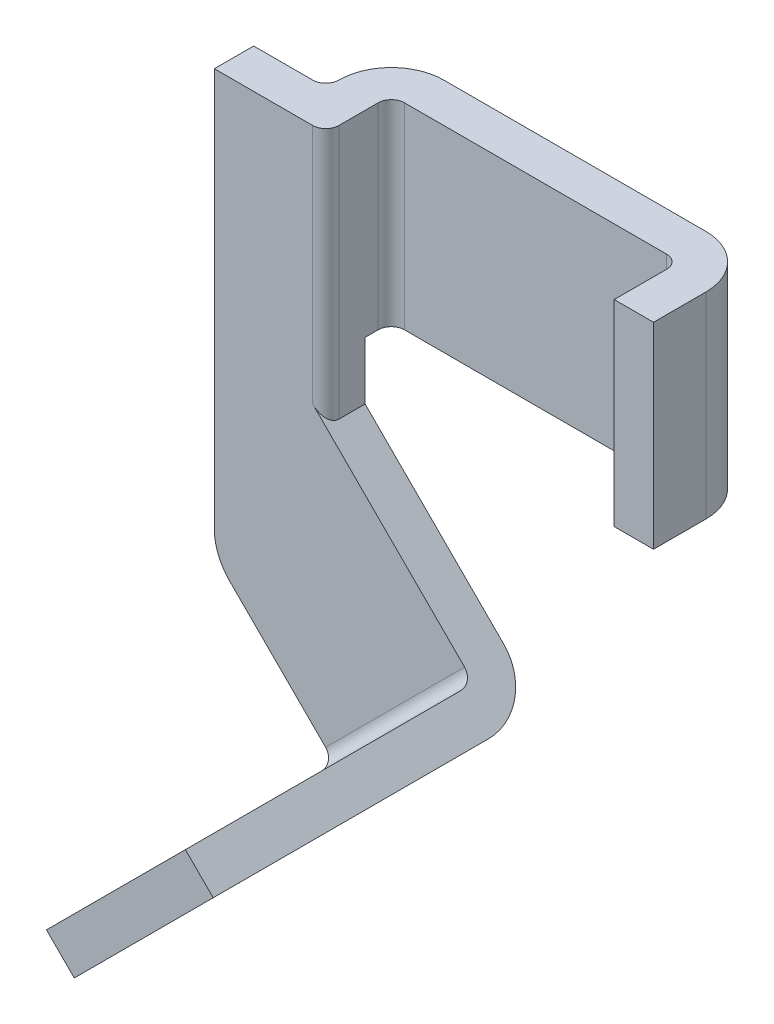
ISO-10303-21;
HEADER;
FILE_DESCRIPTION(('STEP AP214'),'2;1');
FILE_NAME('part.step','',(''),(''),'','','');
FILE_SCHEMA(('AUTOMOTIVE_DESIGN { 1 0 10303 214 1 1 1 1 }'));
ENDSEC;
DATA;
#1=APPLICATION_CONTEXT('core data for automotive mechanical design processes');
#2=APPLICATION_PROTOCOL_DEFINITION('international standard','automotive_design',2000,#1);
#3=PRODUCT_CONTEXT('',#1,'mechanical');
#4=PRODUCT('Part','Part','',(#3));
#5=PRODUCT_RELATED_PRODUCT_CATEGORY('part','',(#4));
#6=PRODUCT_DEFINITION_FORMATION('','',#4);
#7=PRODUCT_DEFINITION_CONTEXT('part definition',#1,'design');
#8=PRODUCT_DEFINITION('design','',#6,#7);
#9=PRODUCT_DEFINITION_SHAPE('','',#8);
#10=(LENGTH_UNIT() NAMED_UNIT(*) SI_UNIT(.MILLI.,.METRE.));
#11=(NAMED_UNIT(*) PLANE_ANGLE_UNIT() SI_UNIT($,.RADIAN.));
#12=(NAMED_UNIT(*) SI_UNIT($,.STERADIAN.) SOLID_ANGLE_UNIT());
#13=UNCERTAINTY_MEASURE_WITH_UNIT(LENGTH_MEASURE(1.E-05),#10,'distance_accuracy_value','');
#14=(GEOMETRIC_REPRESENTATION_CONTEXT(3) GLOBAL_UNCERTAINTY_ASSIGNED_CONTEXT((#13)) GLOBAL_UNIT_ASSIGNED_CONTEXT((#10,
#11,#12)) REPRESENTATION_CONTEXT('',''));
#15=CARTESIAN_POINT('',(0.,0.,0.));
#16=DIRECTION('',(0.,0.,1.));
#17=DIRECTION('',(1.,0.,0.));
#18=AXIS2_PLACEMENT_3D('',#15,#16,#17);
#19=CARTESIAN_POINT('',(-9.549999999999,7.29,2.2));
#20=DIRECTION('',(1.,0.,0.));
#21=DIRECTION('',(0.,1.,0.));
#22=AXIS2_PLACEMENT_3D('',#19,#20,#21);
#23=PLANE('',#22);
#24=DIRECTION('',(0.,1.,0.));
#25=VECTOR('',#24,1.);
#26=CARTESIAN_POINT('',(-9.550000000009,7.455685424959,2.50000000001));
#27=LINE('',#26,#25);
#28=CARTESIAN_POINT('',(-9.549999999999,7.455685424949,2.5));
#29=VERTEX_POINT('',#28);
#30=CARTESIAN_POINT('',(-9.549999999999,10.5,2.5));
#31=VERTEX_POINT('',#30);
#32=EDGE_CURVE('E429',#29,#31,#27,.T.);
#33=ORIENTED_EDGE('',*,*,#32,.T.);
#34=DIRECTION('',(0.,0.,1.));
#35=VECTOR('',#34,1.);
#36=CARTESIAN_POINT('',(-9.550000000009,10.50000000001,2.20000000001));
#37=LINE('',#36,#35);
#38=CARTESIAN_POINT('',(-9.549999999999,10.5,2.2));
#39=VERTEX_POINT('',#38);
#40=EDGE_CURVE('E268',#39,#31,#37,.T.);
#41=ORIENTED_EDGE('',*,*,#40,.F.);
#42=DIRECTION('',(0.,-1.,0.));
#43=VECTOR('',#42,1.);
#44=CARTESIAN_POINT('',(-9.550000000009,10.50000000001,2.20000000001));
#45=LINE('',#44,#43);
#46=CARTESIAN_POINT('',(-9.549999999999,7.455685424949,2.2));
#47=VERTEX_POINT('',#46);
#48=EDGE_CURVE('E281',#39,#47,#45,.T.);
#49=ORIENTED_EDGE('',*,*,#48,.T.);
#50=DIRECTION('',(0.,0.,-1.));
#51=VECTOR('',#50,1.);
#52=CARTESIAN_POINT('',(-9.550000000009,7.455685424959,2.50000000001));
#53=LINE('',#52,#51);
#54=EDGE_CURVE('E326',#29,#47,#53,.T.);
#55=ORIENTED_EDGE('',*,*,#54,.F.);
#56=EDGE_LOOP('',(#33,#41,#49,#55));
#57=FACE_BOUND('',#56,.T.);
#58=ADVANCED_FACE('F17',(#57),#23,.F.);
#59=CARTESIAN_POINT('',(-6.199999999999,10.5,2.5));
#60=DIRECTION('',(0.,0.,1.));
#61=DIRECTION('',(1.,0.,0.));
#62=AXIS2_PLACEMENT_3D('',#59,#60,#61);
#63=PLANE('',#62);
#64=DIRECTION('',(-1.,0.,0.));
#65=VECTOR('',#64,1.);
#66=CARTESIAN_POINT('',(-6.200000000009,9.00000000001,2.50000000001));
#67=LINE('',#66,#65);
#68=CARTESIAN_POINT('',(-6.199999999999,9.,2.5));
#69=VERTEX_POINT('',#68);
#70=CARTESIAN_POINT('',(-6.499999999999,9.,2.5));
#71=VERTEX_POINT('',#70);
#72=EDGE_CURVE('E343',#69,#71,#67,.T.);
#73=ORIENTED_EDGE('',*,*,#72,.F.);
#74=DIRECTION('',(0.,-1.,0.));
#75=VECTOR('',#74,1.);
#76=CARTESIAN_POINT('',(-6.200000000009,10.50000000001,2.50000000001));
#77=LINE('',#76,#75);
#78=CARTESIAN_POINT('',(-6.199999999999,10.5,2.5));
#79=VERTEX_POINT('',#78);
#80=EDGE_CURVE('E540',#79,#69,#77,.T.);
#81=ORIENTED_EDGE('',*,*,#80,.F.);
#82=DIRECTION('',(1.,0.,0.));
#83=VECTOR('',#82,1.);
#84=CARTESIAN_POINT('',(-6.500000000009,10.50000000001,2.50000000001));
#85=LINE('',#84,#83);
#86=CARTESIAN_POINT('',(-6.499999999999,10.5,2.5));
#87=VERTEX_POINT('',#86);
#88=EDGE_CURVE('E307',#87,#79,#85,.T.);
#89=ORIENTED_EDGE('',*,*,#88,.F.);
#90=DIRECTION('',(0.,1.,0.));
#91=VECTOR('',#90,1.);
#92=CARTESIAN_POINT('',(-6.500000000009,9.00000000001,2.50000000001));
#93=LINE('',#92,#91);
#94=EDGE_CURVE('E11',#71,#87,#93,.T.);
#95=ORIENTED_EDGE('',*,*,#94,.F.);
#96=EDGE_LOOP('',(#73,#81,#89,#95));
#97=FACE_BOUND('',#96,.T.);
#98=ADVANCED_FACE('F484',(#97),#63,.T.);
#99=CARTESIAN_POINT('',(-6.499999999999,10.5,2.5));
#100=DIRECTION('',(1.,0.,0.));
#101=DIRECTION('',(0.,1.,0.));
#102=AXIS2_PLACEMENT_3D('',#99,#100,#101);
#103=PLANE('',#102);
#104=DIRECTION('',(0.,0.,1.));
#105=VECTOR('',#104,1.);
#106=CARTESIAN_POINT('',(-6.500000000009,9.00000000001,2.10000000001));
#107=LINE('',#106,#105);
#108=CARTESIAN_POINT('',(-6.499999999999,9.,2.1));
#109=VERTEX_POINT('',#108);
#110=EDGE_CURVE('E347',#109,#71,#107,.T.);
#111=ORIENTED_EDGE('',*,*,#110,.T.);
#112=ORIENTED_EDGE('',*,*,#94,.T.);
#113=DIRECTION('',(0.,0.,-1.));
#114=VECTOR('',#113,1.);
#115=CARTESIAN_POINT('',(-6.500000000009,10.50000000001,2.50000000001));
#116=LINE('',#115,#114);
#117=CARTESIAN_POINT('',(-6.499999999999,10.5,2.1));
#118=VERTEX_POINT('',#117);
#119=EDGE_CURVE('E299',#87,#118,#116,.T.);
#120=ORIENTED_EDGE('',*,*,#119,.T.);
#121=DIRECTION('',(0.,1.,0.));
#122=VECTOR('',#121,1.);
#123=CARTESIAN_POINT('',(-6.500000000009,9.00000000001,2.10000000001));
#124=LINE('',#123,#122);
#125=EDGE_CURVE('E27',#109,#118,#124,.T.);
#126=ORIENTED_EDGE('',*,*,#125,.F.);
#127=EDGE_LOOP('',(#111,#112,#120,#126));
#128=FACE_BOUND('',#127,.T.);
#129=ADVANCED_FACE('F487',(#128),#103,.F.);
#130=CARTESIAN_POINT('',(-6.599999999999,10.5,2.1));
#131=DIRECTION('',(0.,-1.,0.));
#132=DIRECTION('',(0.,0.,-1.));
#133=AXIS2_PLACEMENT_3D('',#130,#131,#132);
#134=CYLINDRICAL_SURFACE('',#133,0.1);
#135=ORIENTED_EDGE('',*,*,#125,.T.);
#136=CARTESIAN_POINT('',(-6.600000000009,10.50000000001,2.10000000001));
#137=DIRECTION('',(0.,-1.,0.));
#138=DIRECTION('',(0.,0.,-1.));
#139=AXIS2_PLACEMENT_3D('',#136,#137,#138);
#140=CIRCLE('',#139,0.10000000001);
#141=CARTESIAN_POINT('',(-6.599999999999,10.5,2.));
#142=VERTEX_POINT('',#141);
#143=EDGE_CURVE('E295',#142,#118,#140,.T.);
#144=ORIENTED_EDGE('',*,*,#143,.F.);
#145=DIRECTION('',(0.,-1.,0.));
#146=VECTOR('',#145,1.);
#147=CARTESIAN_POINT('',(-6.600000000009,10.50000000001,2.00000000001));
#148=LINE('',#147,#146);
#149=CARTESIAN_POINT('',(-6.599999999999,9.,2.));
#150=VERTEX_POINT('',#149);
#151=EDGE_CURVE('E276',#142,#150,#148,.T.);
#152=ORIENTED_EDGE('',*,*,#151,.T.);
#153=CARTESIAN_POINT('',(-6.600000000009,9.00000000001,2.10000000001));
#154=DIRECTION('',(0.,1.,0.));
#155=DIRECTION('',(1.,0.,0.));
#156=AXIS2_PLACEMENT_3D('',#153,#154,#155);
#157=CIRCLE('',#156,0.10000000001);
#158=EDGE_CURVE('E351',#109,#150,#157,.T.);
#159=ORIENTED_EDGE('',*,*,#158,.F.);
#160=EDGE_LOOP('',(#135,#144,#152,#159));
#161=FACE_BOUND('',#160,.T.);
#162=ADVANCED_FACE('F600',(#161),#134,.F.);
#163=CARTESIAN_POINT('',(-6.199999999999,10.5,2.));
#164=DIRECTION('',(0.,0.,-1.));
#165=DIRECTION('',(0.,-1.,0.));
#166=AXIS2_PLACEMENT_3D('',#163,#164,#165);
#167=PLANE('',#166);
#168=DIRECTION('',(1.,0.,0.));
#169=VECTOR('',#168,1.);
#170=CARTESIAN_POINT('',(-8.600000000009,9.00000000001,2.00000000001));
#171=LINE('',#170,#169);
#172=CARTESIAN_POINT('',(-8.599999999999,9.,2.));
#173=VERTEX_POINT('',#172);
#174=EDGE_CURVE('E362',#173,#150,#171,.T.);
#175=ORIENTED_EDGE('',*,*,#174,.T.);
#176=ORIENTED_EDGE('',*,*,#151,.F.);
#177=DIRECTION('',(-1.,0.,0.));
#178=VECTOR('',#177,1.);
#179=CARTESIAN_POINT('',(-6.600000000009,10.50000000001,2.00000000001));
#180=LINE('',#179,#178);
#181=CARTESIAN_POINT('',(-8.599999999999,10.5,2.));
#182=VERTEX_POINT('',#181);
#183=EDGE_CURVE('E291',#142,#182,#180,.T.);
#184=ORIENTED_EDGE('',*,*,#183,.T.);
#185=DIRECTION('',(0.,1.,0.));
#186=VECTOR('',#185,1.);
#187=CARTESIAN_POINT('',(-8.600000000009,9.00000000001,2.00000000001));
#188=LINE('',#187,#186);
#189=EDGE_CURVE('E411',#173,#182,#188,.T.);
#190=ORIENTED_EDGE('',*,*,#189,.F.);
#191=EDGE_LOOP('',(#175,#176,#184,#190));
#192=FACE_BOUND('',#191,.T.);
#193=ADVANCED_FACE('F597',(#192),#167,.F.);
#194=CARTESIAN_POINT('',(-8.599999999999,10.5,2.1));
#195=DIRECTION('',(0.,-1.,0.));
#196=DIRECTION('',(0.,0.,-1.));
#197=AXIS2_PLACEMENT_3D('',#194,#195,#196);
#198=CYLINDRICAL_SURFACE('',#197,0.1);
#199=ORIENTED_EDGE('',*,*,#189,.T.);
#200=CARTESIAN_POINT('',(-8.600000000009,10.50000000001,2.10000000001));
#201=DIRECTION('',(0.,-1.,0.));
#202=DIRECTION('',(-1.,0.,0.));
#203=AXIS2_PLACEMENT_3D('',#200,#201,#202);
#204=CIRCLE('',#203,0.10000000001);
#205=CARTESIAN_POINT('',(-8.699999999999,10.5,2.1));
#206=VERTEX_POINT('',#205);
#207=EDGE_CURVE('E255',#206,#182,#204,.T.);
#208=ORIENTED_EDGE('',*,*,#207,.F.);
#209=DIRECTION('',(0.,-1.,0.));
#210=VECTOR('',#209,1.);
#211=CARTESIAN_POINT('',(-8.700000000009,10.50000000001,2.10000000001));
#212=LINE('',#211,#210);
#213=CARTESIAN_POINT('',(-8.699999999999,9.,2.1));
#214=VERTEX_POINT('',#213);
#215=EDGE_CURVE('E250',#206,#214,#212,.T.);
#216=ORIENTED_EDGE('',*,*,#215,.T.);
#217=CARTESIAN_POINT('',(-8.600000000009,9.00000000001,2.10000000001));
#218=DIRECTION('',(0.,1.,0.));
#219=DIRECTION('',(0.,0.,-1.));
#220=AXIS2_PLACEMENT_3D('',#217,#218,#219);
#221=CIRCLE('',#220,0.10000000001);
#222=EDGE_CURVE('E366',#173,#214,#221,.T.);
#223=ORIENTED_EDGE('',*,*,#222,.F.);
#224=EDGE_LOOP('',(#199,#208,#216,#223));
#225=FACE_BOUND('',#224,.T.);
#226=ADVANCED_FACE('F592',(#225),#198,.F.);
#227=CARTESIAN_POINT('',(-8.699999999999,10.5,2.2));
#228=DIRECTION('',(-1.,0.,0.));
#229=DIRECTION('',(0.,0.,1.));
#230=AXIS2_PLACEMENT_3D('',#227,#228,#229);
#231=PLANE('',#230);
#232=DIRECTION('',(0.,0.,-1.));
#233=VECTOR('',#232,1.);
#234=CARTESIAN_POINT('',(-8.700000000009,10.50000000001,2.40000000001));
#235=LINE('',#234,#233);
#236=CARTESIAN_POINT('',(-8.699999999999,10.5,2.4));
#237=VERTEX_POINT('',#236);
#238=EDGE_CURVE('E247',#237,#206,#235,.T.);
#239=ORIENTED_EDGE('',*,*,#238,.F.);
#240=DIRECTION('',(0.,1.,0.));
#241=VECTOR('',#240,1.);
#242=CARTESIAN_POINT('',(-8.700000000009,8.56000000001,2.40000000001));
#243=LINE('',#242,#241);
#244=CARTESIAN_POINT('',(-8.699999999999,8.56,2.4));
#245=VERTEX_POINT('',#244);
#246=EDGE_CURVE('E235',#245,#237,#243,.T.);
#247=ORIENTED_EDGE('',*,*,#246,.F.);
#248=DIRECTION('',(0.,0.,1.));
#249=VECTOR('',#248,1.);
#250=CARTESIAN_POINT('',(-8.700000000009,8.56000000001,2.20000000001));
#251=LINE('',#250,#249);
#252=CARTESIAN_POINT('',(-8.699999999999,8.56,2.2));
#253=VERTEX_POINT('',#252);
#254=EDGE_CURVE('E64',#253,#245,#251,.T.);
#255=ORIENTED_EDGE('',*,*,#254,.F.);
#256=DIRECTION('',(0.,1.,0.));
#257=VECTOR('',#256,1.);
#258=CARTESIAN_POINT('',(-8.700000000009,8.56000000001,2.20000000001));
#259=LINE('',#258,#257);
#260=CARTESIAN_POINT('',(-8.699999999999,9.,2.2));
#261=VERTEX_POINT('',#260);
#262=EDGE_CURVE('E277',#253,#261,#259,.T.);
#263=ORIENTED_EDGE('',*,*,#262,.T.);
#264=DIRECTION('',(0.,0.,1.));
#265=VECTOR('',#264,1.);
#266=CARTESIAN_POINT('',(-8.700000000009,9.00000000001,2.10000000001));
#267=LINE('',#266,#265);
#268=EDGE_CURVE('E370',#214,#261,#267,.T.);
#269=ORIENTED_EDGE('',*,*,#268,.F.);
#270=ORIENTED_EDGE('',*,*,#215,.F.);
#271=EDGE_LOOP('',(#239,#247,#255,#263,#269,#270));
#272=FACE_BOUND('',#271,.T.);
#273=ADVANCED_FACE('F248',(#272),#231,.F.);
#274=CARTESIAN_POINT('',(-8.701471862575,6.441471862576,2.6));
#275=DIRECTION('',(-0.707106781186548,-0.707106781186548,0.));
#276=DIRECTION('',(-0.707106781186548,0.707106781186548,0.));
#277=AXIS2_PLACEMENT_3D('',#274,#275,#276);
#278=CYLINDRICAL_SURFACE('',#277,0.1);
#279=DIRECTION('',(0.707106781186548,0.707106781186548,0.));
#280=VECTOR('',#279,1.);
#281=CARTESIAN_POINT('',(-8.630761184466,6.370761184467,2.600000000011));
#282=LINE('',#281,#280);
#283=CARTESIAN_POINT('',(-8.630761184456,6.370761184457,2.600000000001));
#284=VERTEX_POINT('',#283);
#285=CARTESIAN_POINT('',(-7.570761184456,7.430761184457,2.600000000001));
#286=VERTEX_POINT('',#285);
#287=EDGE_CURVE('E54',#284,#286,#282,.T.);
#288=ORIENTED_EDGE('',*,*,#287,.T.);
#289=CARTESIAN_POINT('',(-7.641471862585,7.501471862586,2.60000000001));
#290=DIRECTION('',(-0.707106781186548,-0.707106781186548,0.));
#291=DIRECTION('',(0.,0.,-1.));
#292=AXIS2_PLACEMENT_3D('',#289,#290,#291);
#293=CIRCLE('',#292,0.10000000001);
#294=CARTESIAN_POINT('',(-7.641471862575,7.501471862576,2.5));
#295=VERTEX_POINT('',#294);
#296=EDGE_CURVE('E308',#295,#286,#293,.T.);
#297=ORIENTED_EDGE('',*,*,#296,.F.);
#298=DIRECTION('',(0.707106781186548,0.707106781186548,0.));
#299=VECTOR('',#298,1.);
#300=CARTESIAN_POINT('',(-8.701471862585,6.441471862586,2.50000000001));
#301=LINE('',#300,#299);
#302=CARTESIAN_POINT('',(-8.701471862575,6.441471862576,2.5));
#303=VERTEX_POINT('',#302);
#304=EDGE_CURVE('E432',#303,#295,#301,.T.);
#305=ORIENTED_EDGE('',*,*,#304,.F.);
#306=CARTESIAN_POINT('',(-8.701471862585,6.441471862586,2.60000000001));
#307=DIRECTION('',(0.707106781186548,0.707106781186548,0.));
#308=DIRECTION('',(0.707106781186548,-0.707106781186548,1.36974867592751E-10));
#309=AXIS2_PLACEMENT_3D('',#306,#307,#308);
#310=CIRCLE('',#309,0.100000000014142);
#311=EDGE_CURVE('E422',#284,#303,#310,.T.);
#312=ORIENTED_EDGE('',*,*,#311,.F.);
#313=EDGE_LOOP('',(#288,#297,#305,#312));
#314=FACE_BOUND('',#313,.T.);
#315=ADVANCED_FACE('F519',(#314),#278,.F.);
#316=CARTESIAN_POINT('',(-8.630761184456,6.370761184457,4.7));
#317=DIRECTION('',(-0.707106781186548,0.707106781186548,0.));
#318=DIRECTION('',(0.,0.,1.));
#319=AXIS2_PLACEMENT_3D('',#316,#317,#318);
#320=PLANE('',#319);
#321=DIRECTION('',(-0.707106781186548,-0.707106781186548,0.));
#322=VECTOR('',#321,1.);
#323=CARTESIAN_POINT('',(-7.570761184466,7.430761184467,4.70000000001));
#324=LINE('',#323,#322);
#325=CARTESIAN_POINT('',(-7.570761184456,7.430761184457,4.7));
#326=VERTEX_POINT('',#325);
#327=CARTESIAN_POINT('',(-8.630761184456,6.370761184457,4.7));
#328=VERTEX_POINT('',#327);
#329=EDGE_CURVE('E290',#326,#328,#324,.T.);
#330=ORIENTED_EDGE('',*,*,#329,.F.);
#331=DIRECTION('',(4.81646429337999E-12,-4.81688723548461E-12,1.));
#332=VECTOR('',#331,1.);
#333=CARTESIAN_POINT('',(-7.570761184466,7.430761184467,2.600000000011));
#334=LINE('',#333,#332);
#335=EDGE_CURVE('E312',#286,#326,#334,.T.);
#336=ORIENTED_EDGE('',*,*,#335,.F.);
#337=ORIENTED_EDGE('',*,*,#287,.F.);
#338=DIRECTION('',(-4.81688723548461E-12,4.81646429337999E-12,-1.));
#339=VECTOR('',#338,1.);
#340=CARTESIAN_POINT('',(-8.630761184466,6.370761184467,4.70000000001));
#341=LINE('',#340,#339);
#342=EDGE_CURVE('E418',#328,#284,#341,.T.);
#343=ORIENTED_EDGE('',*,*,#342,.F.);
#344=EDGE_LOOP('',(#330,#336,#337,#343));
#345=FACE_BOUND('',#344,.T.);
#346=ADVANCED_FACE('F564',(#345),#320,.T.);
#347=CARTESIAN_POINT('',(-8.630761184456,6.370761184457,4.7));
#348=DIRECTION('',(0.,0.,-1.));
#349=DIRECTION('',(0.,-1.,0.));
#350=AXIS2_PLACEMENT_3D('',#347,#348,#349);
#351=PLANE('',#350);
#352=DIRECTION('',(-0.707106781186297,0.707106781186798,0.));
#353=VECTOR('',#352,1.);
#354=CARTESIAN_POINT('',(-7.358629150111,7.218629150111,4.70000000001));
#355=LINE('',#354,#353);
#356=CARTESIAN_POINT('',(-7.358629150101,7.218629150101,4.7));
#357=VERTEX_POINT('',#356);
#358=EDGE_CURVE('E334',#357,#326,#355,.T.);
#359=ORIENTED_EDGE('',*,*,#358,.T.);
#360=ORIENTED_EDGE('',*,*,#329,.T.);
#361=DIRECTION('',(0.707106781186548,-0.707106781186548,0.));
#362=VECTOR('',#361,1.);
#363=CARTESIAN_POINT('',(-8.630761184466,6.370761184467,4.70000000001));
#364=LINE('',#363,#362);
#365=CARTESIAN_POINT('',(-8.418629150101,6.158629150101,4.7));
#366=VERTEX_POINT('',#365);
#367=EDGE_CURVE('E415',#328,#366,#364,.T.);
#368=ORIENTED_EDGE('',*,*,#367,.T.);
#369=DIRECTION('',(0.707106781186548,0.707106781186548,0.));
#370=VECTOR('',#369,1.);
#371=CARTESIAN_POINT('',(-8.418629150111,6.158629150111,4.70000000001));
#372=LINE('',#371,#370);
#373=EDGE_CURVE('E40',#366,#357,#372,.T.);
#374=ORIENTED_EDGE('',*,*,#373,.T.);
#375=EDGE_LOOP('',(#359,#360,#368,#374));
#376=FACE_BOUND('',#375,.T.);
#377=ADVANCED_FACE('F474',(#376),#351,.F.);
#378=CARTESIAN_POINT('',(-7.358629150101,7.218629150101,4.7));
#379=DIRECTION('',(0.707106781186548,-0.707106781186548,0.));
#380=DIRECTION('',(0.,0.,-1.));
#381=AXIS2_PLACEMENT_3D('',#378,#379,#380);
#382=PLANE('',#381);
#383=ORIENTED_EDGE('',*,*,#373,.F.);
#384=DIRECTION('',(-4.82111665652389E-12,4.82238548283774E-12,1.));
#385=VECTOR('',#384,1.);
#386=CARTESIAN_POINT('',(-8.418629150111,6.158629150111,2.600000000008));
#387=LINE('',#386,#385);
#388=CARTESIAN_POINT('',(-8.418629150101,6.158629150101,2.599999999995));
#389=VERTEX_POINT('',#388);
#390=EDGE_CURVE('E408',#389,#366,#387,.T.);
#391=ORIENTED_EDGE('',*,*,#390,.F.);
#392=DIRECTION('',(-0.707106781186548,-0.707106781186548,0.));
#393=VECTOR('',#392,1.);
#394=CARTESIAN_POINT('',(-7.358629150111,7.218629150111,2.600000000008));
#395=LINE('',#394,#393);
#396=CARTESIAN_POINT('',(-7.358629150101,7.218629150101,2.599999999998));
#397=VERTEX_POINT('',#396);
#398=EDGE_CURVE('E403',#397,#389,#395,.T.);
#399=ORIENTED_EDGE('',*,*,#398,.F.);
#400=DIRECTION('',(4.86002733014863E-12,-4.78432069342223E-12,-1.));
#401=VECTOR('',#400,1.);
#402=CARTESIAN_POINT('',(-7.358629150111,7.218629150111,4.70000000001));
#403=LINE('',#402,#401);
#404=EDGE_CURVE('E318',#357,#397,#403,.T.);
#405=ORIENTED_EDGE('',*,*,#404,.F.);
#406=EDGE_LOOP('',(#383,#391,#399,#405));
#407=FACE_BOUND('',#406,.T.);
#408=ADVANCED_FACE('F460',(#407),#382,.T.);
#409=CARTESIAN_POINT('',(-8.699999999999,8.56,2.2));
#410=DIRECTION('',(-0.707106781186548,-0.707106781186548,0.));
#411=DIRECTION('',(-0.707106781186548,0.707106781186548,0.));
#412=AXIS2_PLACEMENT_3D('',#409,#410,#411);
#413=PLANE('',#412);
#414=DIRECTION('',(0.707106781186548,-0.707106781186548,0.));
#415=VECTOR('',#414,1.);
#416=CARTESIAN_POINT('',(-8.700000000009,8.56000000001,2.20000000001));
#417=LINE('',#416,#415);
#418=CARTESIAN_POINT('',(-7.641471862575,7.501471862576,2.2));
#419=VERTEX_POINT('',#418);
#420=EDGE_CURVE('E280',#253,#419,#417,.T.);
#421=ORIENTED_EDGE('',*,*,#420,.F.);
#422=ORIENTED_EDGE('',*,*,#254,.T.);
#423=CARTESIAN_POINT('',(-8.700000000009,8.56000000001,2.40000000001));
#424=CARTESIAN_POINT('',(-8.700000000009,8.56000000001,2.44457753182084));
#425=CARTESIAN_POINT('',(-8.73059851756703,8.59059851756803,2.47329429084901));
#426=CARTESIAN_POINT('',(-8.75905420470987,8.61905420471087,2.50000000001));
#427=CARTESIAN_POINT('',(-8.800000000009,8.66000000001,2.50000000001));
#428=B_SPLINE_CURVE_WITH_KNOTS('',2,(#423,#424,#425,#426,#427),.UNSPECIFIED.,.F.,.F.,(3,2,3),
(0.,0.5,1.),.UNSPECIFIED.);
#429=CARTESIAN_POINT('',(-8.799999999999,8.66,2.5));
#430=VERTEX_POINT('',#429);
#431=EDGE_CURVE('E70',#245,#430,#428,.T.);
#432=ORIENTED_EDGE('',*,*,#431,.T.);
#433=DIRECTION('',(-0.707106781186548,0.707106781186548,0.));
#434=VECTOR('',#433,1.);
#435=CARTESIAN_POINT('',(-7.641471862585,7.501471862586,2.50000000001));
#436=LINE('',#435,#434);
#437=EDGE_CURVE('E436',#295,#430,#436,.T.);
#438=ORIENTED_EDGE('',*,*,#437,.F.);
#439=ORIENTED_EDGE('',*,*,#296,.T.);
#440=ORIENTED_EDGE('',*,*,#335,.T.);
#441=ORIENTED_EDGE('',*,*,#358,.F.);
#442=ORIENTED_EDGE('',*,*,#404,.T.);
#443=CARTESIAN_POINT('',(-7.641471862585,7.501471862586,2.60000000001));
#444=DIRECTION('',(0.707106781186548,0.707106781186548,0.));
#445=DIRECTION('',(0.707106781186548,-0.707106781186548,-3.86002320502962E-11));
#446=AXIS2_PLACEMENT_3D('',#443,#444,#445);
#447=CIRCLE('',#446,0.400000000014142);
#448=EDGE_CURVE('E400',#397,#419,#447,.T.);
#449=ORIENTED_EDGE('',*,*,#448,.T.);
#450=EDGE_LOOP('',(#421,#422,#432,#438,#439,#440,#441,#442,#449));
#451=FACE_BOUND('',#450,.T.);
#452=ADVANCED_FACE('F450',(#451),#413,.F.);
#453=CARTESIAN_POINT('',(-8.799999999999,10.5,2.4));
#454=DIRECTION('',(0.,-1.,0.));
#455=DIRECTION('',(0.,0.,-1.));
#456=AXIS2_PLACEMENT_3D('',#453,#454,#455);
#457=CYLINDRICAL_SURFACE('',#456,0.1);
#458=ORIENTED_EDGE('',*,*,#246,.T.);
#459=CARTESIAN_POINT('',(-8.800000000009,10.50000000001,2.40000000001));
#460=DIRECTION('',(0.,1.,0.));
#461=DIRECTION('',(0.,0.,1.));
#462=AXIS2_PLACEMENT_3D('',#459,#460,#461);
#463=CIRCLE('',#462,0.10000000001);
#464=CARTESIAN_POINT('',(-8.799999999999,10.5,2.5));
#465=VERTEX_POINT('',#464);
#466=EDGE_CURVE('E239',#465,#237,#463,.T.);
#467=ORIENTED_EDGE('',*,*,#466,.F.);
#468=DIRECTION('',(0.,-1.,0.));
#469=VECTOR('',#468,1.);
#470=CARTESIAN_POINT('',(-8.800000000009,10.50000000001,2.50000000001));
#471=LINE('',#470,#469);
#472=EDGE_CURVE('E244',#465,#430,#471,.T.);
#473=ORIENTED_EDGE('',*,*,#472,.T.);
#474=ORIENTED_EDGE('',*,*,#431,.F.);
#475=EDGE_LOOP('',(#458,#467,#473,#474));
#476=FACE_BOUND('',#475,.T.);
#477=ADVANCED_FACE('F237',(#476),#457,.T.);
#478=CARTESIAN_POINT('',(-8.630761184456,6.370761184457,2.5));
#479=DIRECTION('',(0.,0.,1.));
#480=DIRECTION('',(1.,0.,0.));
#481=AXIS2_PLACEMENT_3D('',#478,#479,#480);
#482=PLANE('',#481);
#483=DIRECTION('',(1.,0.,0.));
#484=VECTOR('',#483,1.);
#485=CARTESIAN_POINT('',(-9.550000000009,10.50000000001,2.50000000001));
#486=LINE('',#485,#484);
#487=EDGE_CURVE('E261',#31,#465,#486,.T.);
#488=ORIENTED_EDGE('',*,*,#487,.F.);
#489=ORIENTED_EDGE('',*,*,#32,.F.);
#490=CARTESIAN_POINT('',(-9.150000000009,7.455685424959,2.50000000001));
#491=DIRECTION('',(0.,0.,1.));
#492=DIRECTION('',(-1.,-2.50466293664081E-11,0.));
#493=AXIS2_PLACEMENT_3D('',#490,#491,#492);
#494=CIRCLE('',#493,0.40000000001);
#495=CARTESIAN_POINT('',(-9.432842712475,7.172842712475,2.5));
#496=VERTEX_POINT('',#495);
#497=EDGE_CURVE('E329',#29,#496,#494,.T.);
#498=ORIENTED_EDGE('',*,*,#497,.T.);
#499=DIRECTION('',(0.707106781186597,-0.707106781186498,0.));
#500=VECTOR('',#499,1.);
#501=CARTESIAN_POINT('',(-9.432842712485,7.172842712485,2.50000000001));
#502=LINE('',#501,#500);
#503=EDGE_CURVE('E426',#496,#303,#502,.T.);
#504=ORIENTED_EDGE('',*,*,#503,.T.);
#505=ORIENTED_EDGE('',*,*,#304,.T.);
#506=ORIENTED_EDGE('',*,*,#437,.T.);
#507=ORIENTED_EDGE('',*,*,#472,.F.);
#508=EDGE_LOOP('',(#488,#489,#498,#504,#505,#506,#507));
#509=FACE_BOUND('',#508,.T.);
#510=ADVANCED_FACE('F479',(#509),#482,.T.);
#511=CARTESIAN_POINT('',(-9.149999999999,7.455685424949,2.2));
#512=DIRECTION('',(0.,0.,-1.));
#513=DIRECTION('',(0.,1.,0.));
#514=AXIS2_PLACEMENT_3D('',#511,#512,#513);
#515=CYLINDRICAL_SURFACE('',#514,0.4);
#516=ORIENTED_EDGE('',*,*,#54,.T.);
#517=CARTESIAN_POINT('',(-9.150000000009,7.455685424959,2.20000000001));
#518=DIRECTION('',(0.,0.,-1.));
#519=DIRECTION('',(-0.707106781190198,-0.707106781182898,0.));
#520=AXIS2_PLACEMENT_3D('',#517,#518,#519);
#521=CIRCLE('',#520,0.400000000014142);
#522=CARTESIAN_POINT('',(-9.432842712475,7.172842712475,2.2));
#523=VERTEX_POINT('',#522);
#524=EDGE_CURVE('E303',#523,#47,#521,.T.);
#525=ORIENTED_EDGE('',*,*,#524,.F.);
#526=DIRECTION('',(0.,0.,1.));
#527=VECTOR('',#526,1.);
#528=CARTESIAN_POINT('',(-9.432842712485,7.172842712485,2.20000000001));
#529=LINE('',#528,#527);
#530=EDGE_CURVE('E330',#523,#496,#529,.T.);
#531=ORIENTED_EDGE('',*,*,#530,.T.);
#532=ORIENTED_EDGE('',*,*,#497,.F.);
#533=EDGE_LOOP('',(#516,#525,#531,#532));
#534=FACE_BOUND('',#533,.T.);
#535=ADVANCED_FACE('F476',(#534),#515,.T.);
#536=CARTESIAN_POINT('',(-9.549999999999,7.29,2.2));
#537=DIRECTION('',(0.707106781186548,0.707106781186548,0.));
#538=DIRECTION('',(0.,0.,-1.));
#539=AXIS2_PLACEMENT_3D('',#536,#537,#538);
#540=PLANE('',#539);
#541=ORIENTED_EDGE('',*,*,#390,.T.);
#542=ORIENTED_EDGE('',*,*,#367,.F.);
#543=ORIENTED_EDGE('',*,*,#342,.T.);
#544=ORIENTED_EDGE('',*,*,#311,.T.);
#545=ORIENTED_EDGE('',*,*,#503,.F.);
#546=ORIENTED_EDGE('',*,*,#530,.F.);
#547=DIRECTION('',(-0.707106781186597,0.707106781186498,0.));
#548=VECTOR('',#547,1.);
#549=CARTESIAN_POINT('',(-8.701471862585,6.441471862586,2.20000000001));
#550=LINE('',#549,#548);
#551=CARTESIAN_POINT('',(-8.701471862575,6.441471862576,2.2));
#552=VERTEX_POINT('',#551);
#553=EDGE_CURVE('E390',#552,#523,#550,.T.);
#554=ORIENTED_EDGE('',*,*,#553,.F.);
#555=CARTESIAN_POINT('',(-8.701471862585,6.441471862586,2.60000000001));
#556=DIRECTION('',(-0.707106781186548,-0.707106781186548,0.));
#557=DIRECTION('',(0.,0.,-1.));
#558=AXIS2_PLACEMENT_3D('',#555,#556,#557);
#559=CIRCLE('',#558,0.40000000001);
#560=EDGE_CURVE('E404',#552,#389,#559,.T.);
#561=ORIENTED_EDGE('',*,*,#560,.T.);
#562=EDGE_LOOP('',(#541,#542,#543,#544,#545,#546,#554,#561));
#563=FACE_BOUND('',#562,.T.);
#564=ADVANCED_FACE('F470',(#563),#540,.F.);
#565=CARTESIAN_POINT('',(-8.701471862575,6.441471862576,2.6));
#566=DIRECTION('',(-0.707106781186548,-0.707106781186548,0.));
#567=DIRECTION('',(-0.707106781186548,0.707106781186548,0.));
#568=AXIS2_PLACEMENT_3D('',#565,#566,#567);
#569=CYLINDRICAL_SURFACE('',#568,0.4);
#570=DIRECTION('',(-0.707106781186548,-0.707106781186548,0.));
#571=VECTOR('',#570,1.);
#572=CARTESIAN_POINT('',(-7.641471862585,7.501471862586,2.20000000001));
#573=LINE('',#572,#571);
#574=EDGE_CURVE('E378',#419,#552,#573,.T.);
#575=ORIENTED_EDGE('',*,*,#574,.F.);
#576=ORIENTED_EDGE('',*,*,#448,.F.);
#577=ORIENTED_EDGE('',*,*,#398,.T.);
#578=ORIENTED_EDGE('',*,*,#560,.F.);
#579=EDGE_LOOP('',(#575,#576,#577,#578));
#580=FACE_BOUND('',#579,.T.);
#581=ADVANCED_FACE('F466',(#580),#569,.T.);
#582=CARTESIAN_POINT('',(-8.630761184456,6.370761184457,2.2));
#583=DIRECTION('',(0.,0.,1.));
#584=DIRECTION('',(1.,0.,0.));
#585=AXIS2_PLACEMENT_3D('',#582,#583,#584);
#586=PLANE('',#585);
#587=ORIENTED_EDGE('',*,*,#553,.T.);
#588=ORIENTED_EDGE('',*,*,#524,.T.);
#589=ORIENTED_EDGE('',*,*,#48,.F.);
#590=DIRECTION('',(-1.,0.,0.));
#591=VECTOR('',#590,1.);
#592=CARTESIAN_POINT('',(-9.100000000009,10.50000000001,2.20000000001));
#593=LINE('',#592,#591);
#594=CARTESIAN_POINT('',(-9.099999999999,10.5,2.2));
#595=VERTEX_POINT('',#594);
#596=EDGE_CURVE('E282',#595,#39,#593,.T.);
#597=ORIENTED_EDGE('',*,*,#596,.F.);
#598=DIRECTION('',(0.,1.,0.));
#599=VECTOR('',#598,1.);
#600=CARTESIAN_POINT('',(-9.100000000009,9.00000000001,2.20000000001));
#601=LINE('',#600,#599);
#602=CARTESIAN_POINT('',(-9.099999999999,9.,2.2));
#603=VERTEX_POINT('',#602);
#604=EDGE_CURVE('E387',#603,#595,#601,.T.);
#605=ORIENTED_EDGE('',*,*,#604,.F.);
#606=DIRECTION('',(-1.,0.,0.));
#607=VECTOR('',#606,1.);
#608=CARTESIAN_POINT('',(-8.700000000009,9.00000000001,2.20000000001));
#609=LINE('',#608,#607);
#610=EDGE_CURVE('E374',#261,#603,#609,.T.);
#611=ORIENTED_EDGE('',*,*,#610,.F.);
#612=ORIENTED_EDGE('',*,*,#262,.F.);
#613=ORIENTED_EDGE('',*,*,#420,.T.);
#614=ORIENTED_EDGE('',*,*,#574,.T.);
#615=EDGE_LOOP('',(#587,#588,#589,#597,#605,#611,#612,#613,#614));
#616=FACE_BOUND('',#615,.T.);
#617=ADVANCED_FACE('F463',(#616),#586,.F.);
#618=CARTESIAN_POINT('',(-9.099999999999,9.,2.1));
#619=DIRECTION('',(0.,1.,0.));
#620=DIRECTION('',(1.,0.,0.));
#621=AXIS2_PLACEMENT_3D('',#618,#619,#620);
#622=CYLINDRICAL_SURFACE('',#621,0.1);
#623=DIRECTION('',(0.,-1.,0.));
#624=VECTOR('',#623,1.);
#625=CARTESIAN_POINT('',(-9.000000000009,10.50000000001,2.10000000001));
#626=LINE('',#625,#624);
#627=CARTESIAN_POINT('',(-8.999999999999,10.5,2.1));
#628=VERTEX_POINT('',#627);
#629=CARTESIAN_POINT('',(-8.999999999999,9.,2.1));
#630=VERTEX_POINT('',#629);
#631=EDGE_CURVE('E357',#628,#630,#626,.T.);
#632=ORIENTED_EDGE('',*,*,#631,.T.);
#633=CARTESIAN_POINT('',(-9.100000000009,9.00000000001,2.10000000001));
#634=DIRECTION('',(0.,1.,0.));
#635=DIRECTION('',(0.,0.,1.));
#636=AXIS2_PLACEMENT_3D('',#633,#634,#635);
#637=CIRCLE('',#636,0.10000000001);
#638=EDGE_CURVE('E358',#603,#630,#637,.T.);
#639=ORIENTED_EDGE('',*,*,#638,.F.);
#640=ORIENTED_EDGE('',*,*,#604,.T.);
#641=CARTESIAN_POINT('',(-9.100000000009,10.50000000001,2.10000000001));
#642=DIRECTION('',(0.,-1.,0.));
#643=DIRECTION('',(1.,0.,-1.00017763558392E-10));
#644=AXIS2_PLACEMENT_3D('',#641,#642,#643);
#645=CIRCLE('',#644,0.10000000001);
#646=EDGE_CURVE('E272',#628,#595,#645,.T.);
#647=ORIENTED_EDGE('',*,*,#646,.F.);
#648=EDGE_LOOP('',(#632,#639,#640,#647));
#649=FACE_BOUND('',#648,.T.);
#650=ADVANCED_FACE('F461',(#649),#622,.F.);
#651=CARTESIAN_POINT('',(-8.599999999999,10.5,2.1));
#652=DIRECTION('',(0.,1.,0.));
#653=DIRECTION('',(1.,0.,0.));
#654=AXIS2_PLACEMENT_3D('',#651,#652,#653);
#655=CYLINDRICAL_SURFACE('',#654,0.4);
#656=DIRECTION('',(0.,-1.,0.));
#657=VECTOR('',#656,1.);
#658=CARTESIAN_POINT('',(-8.600000000009,10.50000000001,1.70000000001));
#659=LINE('',#658,#657);
#660=CARTESIAN_POINT('',(-8.599999999999,10.5,1.7));
#661=VERTEX_POINT('',#660);
#662=CARTESIAN_POINT('',(-8.599999999999,9.,1.7));
#663=VERTEX_POINT('',#662);
#664=EDGE_CURVE('E333',#661,#663,#659,.T.);
#665=ORIENTED_EDGE('',*,*,#664,.T.);
#666=CARTESIAN_POINT('',(-8.600000000009,9.00000000001,2.10000000001));
#667=DIRECTION('',(0.,-1.,0.));
#668=DIRECTION('',(-1.,0.,0.));
#669=AXIS2_PLACEMENT_3D('',#666,#667,#668);
#670=CIRCLE('',#669,0.40000000001);
#671=EDGE_CURVE('E354',#630,#663,#670,.T.);
#672=ORIENTED_EDGE('',*,*,#671,.F.);
#673=ORIENTED_EDGE('',*,*,#631,.F.);
#674=CARTESIAN_POINT('',(-8.600000000009,10.50000000001,2.10000000001));
#675=DIRECTION('',(0.,1.,0.));
#676=DIRECTION('',(0.,0.,-1.));
#677=AXIS2_PLACEMENT_3D('',#674,#675,#676);
#678=CIRCLE('',#677,0.40000000001);
#679=EDGE_CURVE('E532',#661,#628,#678,.T.);
#680=ORIENTED_EDGE('',*,*,#679,.F.);
#681=EDGE_LOOP('',(#665,#672,#673,#680));
#682=FACE_BOUND('',#681,.T.);
#683=ADVANCED_FACE('F839',(#682),#655,.T.);
#684=CARTESIAN_POINT('',(-8.699999999999,9.,1.7));
#685=DIRECTION('',(0.,1.,0.));
#686=DIRECTION('',(1.,0.,0.));
#687=AXIS2_PLACEMENT_3D('',#684,#685,#686);
#688=PLANE('',#687);
#689=DIRECTION('',(0.,0.,1.));
#690=VECTOR('',#689,1.);
#691=CARTESIAN_POINT('',(-6.200000000009,9.00000000001,2.10000000001));
#692=LINE('',#691,#690);
#693=CARTESIAN_POINT('',(-6.199999999999,9.,2.1));
#694=VERTEX_POINT('',#693);
#695=EDGE_CURVE('E535',#694,#69,#692,.T.);
#696=ORIENTED_EDGE('',*,*,#695,.T.);
#697=ORIENTED_EDGE('',*,*,#72,.T.);
#698=ORIENTED_EDGE('',*,*,#110,.F.);
#699=ORIENTED_EDGE('',*,*,#158,.T.);
#700=ORIENTED_EDGE('',*,*,#174,.F.);
#701=ORIENTED_EDGE('',*,*,#222,.T.);
#702=ORIENTED_EDGE('',*,*,#268,.T.);
#703=ORIENTED_EDGE('',*,*,#610,.T.);
#704=ORIENTED_EDGE('',*,*,#638,.T.);
#705=ORIENTED_EDGE('',*,*,#671,.T.);
#706=DIRECTION('',(1.,0.,0.));
#707=VECTOR('',#706,1.);
#708=CARTESIAN_POINT('',(-8.600000000009,9.00000000001,1.70000000001));
#709=LINE('',#708,#707);
#710=CARTESIAN_POINT('',(-6.599999999999,9.,1.7));
#711=VERTEX_POINT('',#710);
#712=EDGE_CURVE('E340',#663,#711,#709,.T.);
#713=ORIENTED_EDGE('',*,*,#712,.T.);
#714=CARTESIAN_POINT('',(-6.600000000009,9.00000000001,2.10000000001));
#715=DIRECTION('',(0.,-1.,0.));
#716=DIRECTION('',(0.,0.,-1.));
#717=AXIS2_PLACEMENT_3D('',#714,#715,#716);
#718=CIRCLE('',#717,0.40000000001);
#719=EDGE_CURVE('E322',#711,#694,#718,.T.);
#720=ORIENTED_EDGE('',*,*,#719,.T.);
#721=EDGE_LOOP('',(#696,#697,#698,#699,#700,#701,#702,#703,#704,#705,#713,#720));
#722=FACE_BOUND('',#721,.T.);
#723=ADVANCED_FACE('F588',(#722),#688,.F.);
#724=CARTESIAN_POINT('',(-8.699999999999,10.5,1.7));
#725=DIRECTION('',(0.,0.,-1.));
#726=DIRECTION('',(0.,-1.,0.));
#727=AXIS2_PLACEMENT_3D('',#724,#725,#726);
#728=PLANE('',#727);
#729=ORIENTED_EDGE('',*,*,#664,.F.);
#730=DIRECTION('',(-1.,0.,0.));
#731=VECTOR('',#730,1.);
#732=CARTESIAN_POINT('',(-6.600000000009,10.50000000001,1.70000000001));
#733=LINE('',#732,#731);
#734=CARTESIAN_POINT('',(-6.599999999999,10.5,1.7));
#735=VERTEX_POINT('',#734);
#736=EDGE_CURVE('E548',#735,#661,#733,.T.);
#737=ORIENTED_EDGE('',*,*,#736,.F.);
#738=DIRECTION('',(0.,1.,0.));
#739=VECTOR('',#738,1.);
#740=CARTESIAN_POINT('',(-6.600000000009,9.00000000001,1.70000000001));
#741=LINE('',#740,#739);
#742=EDGE_CURVE('E325',#711,#735,#741,.T.);
#743=ORIENTED_EDGE('',*,*,#742,.F.);
#744=ORIENTED_EDGE('',*,*,#712,.F.);
#745=EDGE_LOOP('',(#729,#737,#743,#744));
#746=FACE_BOUND('',#745,.T.);
#747=ADVANCED_FACE('F819',(#746),#728,.T.);
#748=CARTESIAN_POINT('',(-6.599999999999,10.5,2.1));
#749=DIRECTION('',(0.,-1.,0.));
#750=DIRECTION('',(0.,0.,-1.));
#751=AXIS2_PLACEMENT_3D('',#748,#749,#750);
#752=CYLINDRICAL_SURFACE('',#751,0.4);
#753=DIRECTION('',(0.,-1.,0.));
#754=VECTOR('',#753,1.);
#755=CARTESIAN_POINT('',(-6.200000000009,10.50000000001,2.10000000001));
#756=LINE('',#755,#754);
#757=CARTESIAN_POINT('',(-6.199999999999,10.5,2.1));
#758=VERTEX_POINT('',#757);
#759=EDGE_CURVE('E539',#758,#694,#756,.T.);
#760=ORIENTED_EDGE('',*,*,#759,.T.);
#761=ORIENTED_EDGE('',*,*,#719,.F.);
#762=ORIENTED_EDGE('',*,*,#742,.T.);
#763=CARTESIAN_POINT('',(-6.600000000009,10.50000000001,2.10000000001));
#764=DIRECTION('',(0.,1.,0.));
#765=DIRECTION('',(1.,0.,0.));
#766=AXIS2_PLACEMENT_3D('',#763,#764,#765);
#767=CIRCLE('',#766,0.40000000001);
#768=EDGE_CURVE('E315',#758,#735,#767,.T.);
#769=ORIENTED_EDGE('',*,*,#768,.F.);
#770=EDGE_LOOP('',(#760,#761,#762,#769));
#771=FACE_BOUND('',#770,.T.);
#772=ADVANCED_FACE('F814',(#771),#752,.T.);
#773=CARTESIAN_POINT('',(-9.549999999999,10.5,2.2));
#774=DIRECTION('',(0.,-1.,0.));
#775=DIRECTION('',(0.,0.,-1.));
#776=AXIS2_PLACEMENT_3D('',#773,#774,#775);
#777=PLANE('',#776);
#778=ORIENTED_EDGE('',*,*,#736,.T.);
#779=ORIENTED_EDGE('',*,*,#679,.T.);
#780=ORIENTED_EDGE('',*,*,#646,.T.);
#781=ORIENTED_EDGE('',*,*,#596,.T.);
#782=ORIENTED_EDGE('',*,*,#40,.T.);
#783=ORIENTED_EDGE('',*,*,#487,.T.);
#784=ORIENTED_EDGE('',*,*,#466,.T.);
#785=ORIENTED_EDGE('',*,*,#238,.T.);
#786=ORIENTED_EDGE('',*,*,#207,.T.);
#787=ORIENTED_EDGE('',*,*,#183,.F.);
#788=ORIENTED_EDGE('',*,*,#143,.T.);
#789=ORIENTED_EDGE('',*,*,#119,.F.);
#790=ORIENTED_EDGE('',*,*,#88,.T.);
#791=DIRECTION('',(0.,0.,-1.));
#792=VECTOR('',#791,1.);
#793=CARTESIAN_POINT('',(-6.200000000009,10.50000000001,2.50000000001));
#794=LINE('',#793,#792);
#795=EDGE_CURVE('E544',#79,#758,#794,.T.);
#796=ORIENTED_EDGE('',*,*,#795,.T.);
#797=ORIENTED_EDGE('',*,*,#768,.T.);
#798=EDGE_LOOP('',(#778,#779,#780,#781,#782,#783,#784,#785,#786,#787,#788,#789,#790,#796,#797));
#799=FACE_BOUND('',#798,.T.);
#800=ADVANCED_FACE('F258',(#799),#777,.F.);
#801=CARTESIAN_POINT('',(-6.199999999999,10.5,2.));
#802=DIRECTION('',(1.,0.,0.));
#803=DIRECTION('',(0.,1.,0.));
#804=AXIS2_PLACEMENT_3D('',#801,#802,#803);
#805=PLANE('',#804);
#806=ORIENTED_EDGE('',*,*,#80,.T.);
#807=ORIENTED_EDGE('',*,*,#695,.F.);
#808=ORIENTED_EDGE('',*,*,#759,.F.);
#809=ORIENTED_EDGE('',*,*,#795,.F.);
#810=EDGE_LOOP('',(#806,#807,#808,#809));
#811=FACE_BOUND('',#810,.T.);
#812=ADVANCED_FACE('F609',(#811),#805,.T.);
#813=CLOSED_SHELL('',(#58,#98,#129,#162,#193,#226,#273,#315,#346,#377,#408,#452,#477,#510,#535,
#564,#581,#617,#650,#683,#723,#747,#772,#800,#812));
#814=MANIFOLD_SOLID_BREP('B1',#813);
#815=ADVANCED_BREP_SHAPE_REPRESENTATION('',(#18,#814),#14);
#816=SHAPE_DEFINITION_REPRESENTATION(#9,#815);
ENDSEC;
END-ISO-10303-21;
